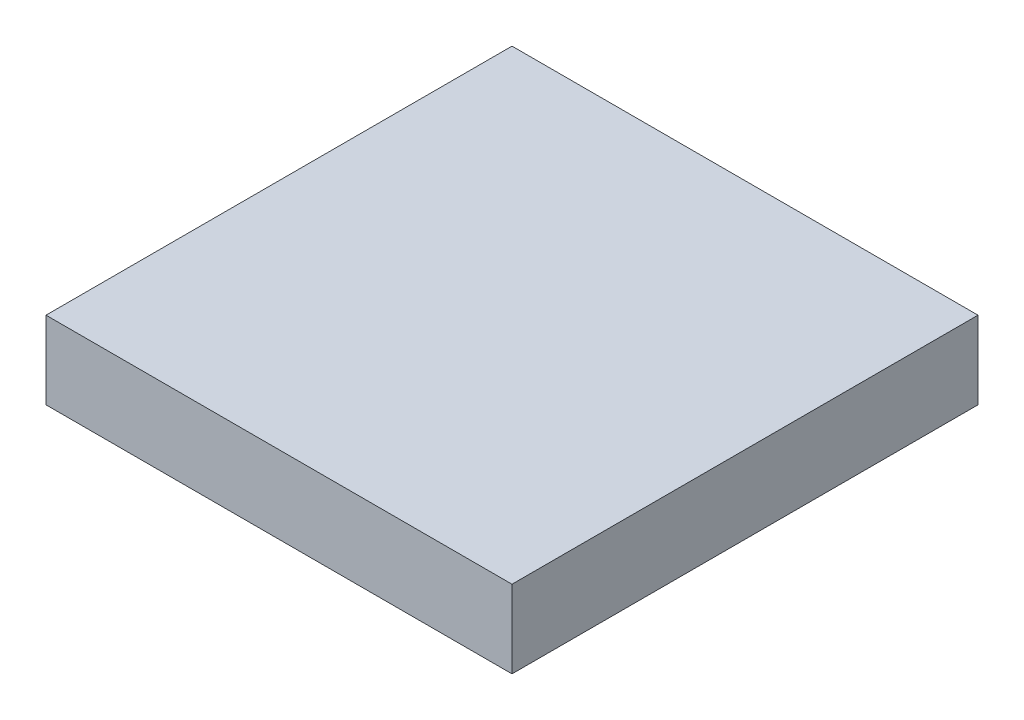
ISO-10303-21;
HEADER;
FILE_DESCRIPTION(('STEP AP214'),'2;1');
FILE_NAME('part.step','',(''),(''),'','','');
FILE_SCHEMA(('AUTOMOTIVE_DESIGN { 1 0 10303 214 1 1 1 1 }'));
ENDSEC;
DATA;
#1=APPLICATION_CONTEXT('core data for automotive mechanical design processes');
#2=APPLICATION_PROTOCOL_DEFINITION('international standard','automotive_design',2000,#1);
#3=PRODUCT_CONTEXT('',#1,'mechanical');
#4=PRODUCT('Part','Part','',(#3));
#5=PRODUCT_RELATED_PRODUCT_CATEGORY('part','',(#4));
#6=PRODUCT_DEFINITION_FORMATION('','',#4);
#7=PRODUCT_DEFINITION_CONTEXT('part definition',#1,'design');
#8=PRODUCT_DEFINITION('design','',#6,#7);
#9=PRODUCT_DEFINITION_SHAPE('','',#8);
#10=(LENGTH_UNIT() NAMED_UNIT(*) SI_UNIT(.MILLI.,.METRE.));
#11=(NAMED_UNIT(*) PLANE_ANGLE_UNIT() SI_UNIT($,.RADIAN.));
#12=(NAMED_UNIT(*) SI_UNIT($,.STERADIAN.) SOLID_ANGLE_UNIT());
#13=UNCERTAINTY_MEASURE_WITH_UNIT(LENGTH_MEASURE(1.E-05),#10,'distance_accuracy_value','');
#14=(GEOMETRIC_REPRESENTATION_CONTEXT(3) GLOBAL_UNCERTAINTY_ASSIGNED_CONTEXT((#13)) GLOBAL_UNIT_ASSIGNED_CONTEXT((#10,
#11,#12)) REPRESENTATION_CONTEXT('',''));
#15=CARTESIAN_POINT('',(0.,0.,0.));
#16=DIRECTION('',(0.,0.,1.));
#17=DIRECTION('',(1.,0.,0.));
#18=AXIS2_PLACEMENT_3D('',#15,#16,#17);
#19=CARTESIAN_POINT('',(0.,500.,0.));
#20=DIRECTION('',(1.,0.,0.));
#21=DIRECTION('',(0.,0.,-1.));
#22=AXIS2_PLACEMENT_3D('',#19,#20,#21);
#23=PLANE('',#22);
#24=DIRECTION('',(0.,0.,1.));
#25=VECTOR('',#24,1.);
#26=CARTESIAN_POINT('',(0.,0.,0.));
#27=LINE('',#26,#25);
#28=CARTESIAN_POINT('',(0.,0.,-3000.));
#29=VERTEX_POINT('',#28);
#30=CARTESIAN_POINT('',(0.,0.,0.));
#31=VERTEX_POINT('',#30);
#32=EDGE_CURVE('E111',#29,#31,#27,.T.);
#33=ORIENTED_EDGE('',*,*,#32,.T.);
#34=DIRECTION('',(0.,-1.,0.));
#35=VECTOR('',#34,1.);
#36=CARTESIAN_POINT('',(0.,500.,0.));
#37=LINE('',#36,#35);
#38=CARTESIAN_POINT('',(0.,500.,0.));
#39=VERTEX_POINT('',#38);
#40=EDGE_CURVE('E11',#39,#31,#37,.T.);
#41=ORIENTED_EDGE('',*,*,#40,.F.);
#42=DIRECTION('',(0.,0.,1.));
#43=VECTOR('',#42,1.);
#44=CARTESIAN_POINT('',(0.,500.,0.));
#45=LINE('',#44,#43);
#46=CARTESIAN_POINT('',(0.,500.,-3000.));
#47=VERTEX_POINT('',#46);
#48=EDGE_CURVE('E95',#47,#39,#45,.T.);
#49=ORIENTED_EDGE('',*,*,#48,.F.);
#50=DIRECTION('',(0.,-1.,0.));
#51=VECTOR('',#50,1.);
#52=CARTESIAN_POINT('',(0.,500.,-3000.));
#53=LINE('',#52,#51);
#54=EDGE_CURVE('E107',#47,#29,#53,.T.);
#55=ORIENTED_EDGE('',*,*,#54,.T.);
#56=EDGE_LOOP('',(#33,#41,#49,#55));
#57=FACE_BOUND('',#56,.T.);
#58=ADVANCED_FACE('F43',(#57),#23,.F.);
#59=CARTESIAN_POINT('',(0.,500.,0.));
#60=DIRECTION('',(0.,0.,-1.));
#61=DIRECTION('',(-1.,0.,0.));
#62=AXIS2_PLACEMENT_3D('',#59,#60,#61);
#63=PLANE('',#62);
#64=DIRECTION('',(1.,0.,0.));
#65=VECTOR('',#64,1.);
#66=CARTESIAN_POINT('',(0.,0.,0.));
#67=LINE('',#66,#65);
#68=CARTESIAN_POINT('',(3000.,0.,0.));
#69=VERTEX_POINT('',#68);
#70=EDGE_CURVE('E100',#31,#69,#67,.T.);
#71=ORIENTED_EDGE('',*,*,#70,.T.);
#72=DIRECTION('',(0.,-1.,0.));
#73=VECTOR('',#72,1.);
#74=CARTESIAN_POINT('',(3000.,500.,0.));
#75=LINE('',#74,#73);
#76=CARTESIAN_POINT('',(3000.,500.,0.));
#77=VERTEX_POINT('',#76);
#78=EDGE_CURVE('E52',#77,#69,#75,.T.);
#79=ORIENTED_EDGE('',*,*,#78,.F.);
#80=DIRECTION('',(1.,0.,0.));
#81=VECTOR('',#80,1.);
#82=CARTESIAN_POINT('',(0.,500.,0.));
#83=LINE('',#82,#81);
#84=EDGE_CURVE('E90',#39,#77,#83,.T.);
#85=ORIENTED_EDGE('',*,*,#84,.F.);
#86=ORIENTED_EDGE('',*,*,#40,.T.);
#87=EDGE_LOOP('',(#71,#79,#85,#86));
#88=FACE_BOUND('',#87,.T.);
#89=ADVANCED_FACE('F99',(#88),#63,.F.);
#90=CARTESIAN_POINT('',(3000.,500.,0.));
#91=DIRECTION('',(-1.,0.,0.));
#92=DIRECTION('',(0.,0.,1.));
#93=AXIS2_PLACEMENT_3D('',#90,#91,#92);
#94=PLANE('',#93);
#95=DIRECTION('',(0.,0.,-1.));
#96=VECTOR('',#95,1.);
#97=CARTESIAN_POINT('',(3000.,0.,0.));
#98=LINE('',#97,#96);
#99=CARTESIAN_POINT('',(3000.,0.,-3000.));
#100=VERTEX_POINT('',#99);
#101=EDGE_CURVE('E77',#69,#100,#98,.T.);
#102=ORIENTED_EDGE('',*,*,#101,.T.);
#103=DIRECTION('',(0.,-1.,0.));
#104=VECTOR('',#103,1.);
#105=CARTESIAN_POINT('',(3000.,500.,-3000.));
#106=LINE('',#105,#104);
#107=CARTESIAN_POINT('',(3000.,500.,-3000.));
#108=VERTEX_POINT('',#107);
#109=EDGE_CURVE('E102',#108,#100,#106,.T.);
#110=ORIENTED_EDGE('',*,*,#109,.F.);
#111=DIRECTION('',(0.,0.,-1.));
#112=VECTOR('',#111,1.);
#113=CARTESIAN_POINT('',(3000.,500.,0.));
#114=LINE('',#113,#112);
#115=EDGE_CURVE('E93',#77,#108,#114,.T.);
#116=ORIENTED_EDGE('',*,*,#115,.F.);
#117=ORIENTED_EDGE('',*,*,#78,.T.);
#118=EDGE_LOOP('',(#102,#110,#116,#117));
#119=FACE_BOUND('',#118,.T.);
#120=ADVANCED_FACE('F103',(#119),#94,.F.);
#121=CARTESIAN_POINT('',(0.,500.,-3000.));
#122=DIRECTION('',(0.,0.,1.));
#123=DIRECTION('',(1.,0.,0.));
#124=AXIS2_PLACEMENT_3D('',#121,#122,#123);
#125=PLANE('',#124);
#126=DIRECTION('',(-1.,0.,0.));
#127=VECTOR('',#126,1.);
#128=CARTESIAN_POINT('',(0.,0.,-3000.));
#129=LINE('',#128,#127);
#130=EDGE_CURVE('E83',#100,#29,#129,.T.);
#131=ORIENTED_EDGE('',*,*,#130,.T.);
#132=ORIENTED_EDGE('',*,*,#54,.F.);
#133=DIRECTION('',(-1.,0.,0.));
#134=VECTOR('',#133,1.);
#135=CARTESIAN_POINT('',(0.,500.,-3000.));
#136=LINE('',#135,#134);
#137=EDGE_CURVE('E60',#108,#47,#136,.T.);
#138=ORIENTED_EDGE('',*,*,#137,.F.);
#139=ORIENTED_EDGE('',*,*,#109,.T.);
#140=EDGE_LOOP('',(#131,#132,#138,#139));
#141=FACE_BOUND('',#140,.T.);
#142=ADVANCED_FACE('F124',(#141),#125,.F.);
#143=CARTESIAN_POINT('',(0.,500.,0.));
#144=DIRECTION('',(0.,-1.,0.));
#145=DIRECTION('',(0.,0.,-1.));
#146=AXIS2_PLACEMENT_3D('',#143,#144,#145);
#147=PLANE('',#146);
#148=ORIENTED_EDGE('',*,*,#48,.T.);
#149=ORIENTED_EDGE('',*,*,#84,.T.);
#150=ORIENTED_EDGE('',*,*,#115,.T.);
#151=ORIENTED_EDGE('',*,*,#137,.T.);
#152=EDGE_LOOP('',(#148,#149,#150,#151));
#153=FACE_BOUND('',#152,.T.);
#154=ADVANCED_FACE('F91',(#153),#147,.F.);
#155=CARTESIAN_POINT('',(0.,0.,0.));
#156=DIRECTION('',(0.,-1.,0.));
#157=DIRECTION('',(0.,0.,-1.));
#158=AXIS2_PLACEMENT_3D('',#155,#156,#157);
#159=PLANE('',#158);
#160=ORIENTED_EDGE('',*,*,#32,.F.);
#161=ORIENTED_EDGE('',*,*,#130,.F.);
#162=ORIENTED_EDGE('',*,*,#101,.F.);
#163=ORIENTED_EDGE('',*,*,#70,.F.);
#164=EDGE_LOOP('',(#160,#161,#162,#163));
#165=FACE_BOUND('',#164,.T.);
#166=ADVANCED_FACE('F127',(#165),#159,.T.);
#167=CLOSED_SHELL('',(#58,#89,#120,#142,#154,#166));
#168=MANIFOLD_SOLID_BREP('B2',#167);
#169=ADVANCED_BREP_SHAPE_REPRESENTATION('',(#18,#168),#14);
#170=SHAPE_DEFINITION_REPRESENTATION(#9,#169);
ENDSEC;
END-ISO-10303-21;
